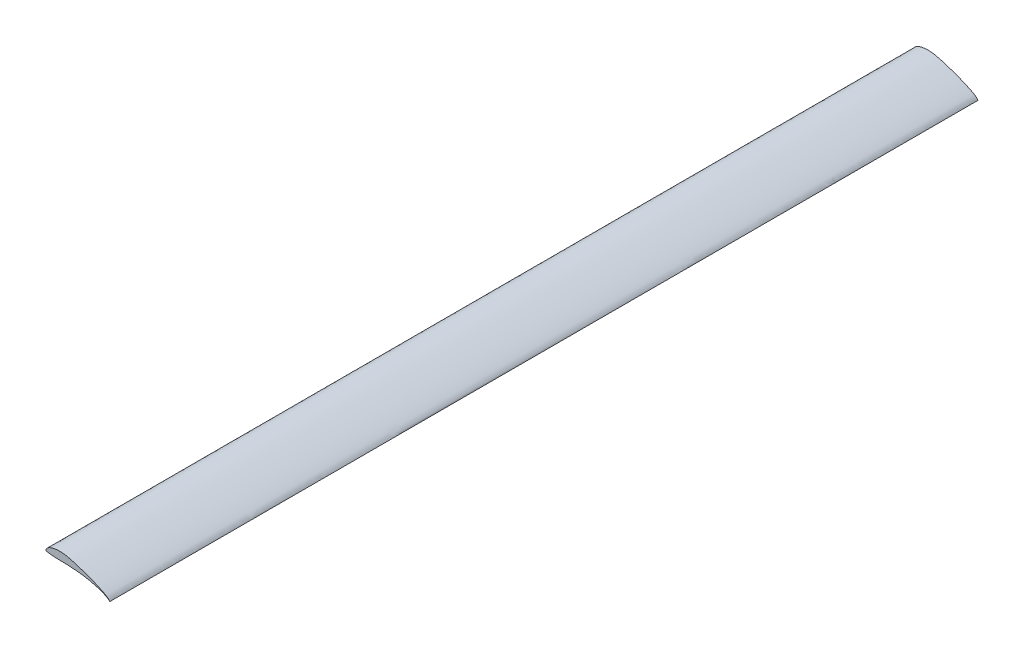
ISO-10303-21;
HEADER;
FILE_DESCRIPTION(('STEP AP214'),'2;1');
FILE_NAME('part.step','',(''),(''),'','','');
FILE_SCHEMA(('AUTOMOTIVE_DESIGN { 1 0 10303 214 1 1 1 1 }'));
ENDSEC;
DATA;
#1=APPLICATION_CONTEXT('core data for automotive mechanical design processes');
#2=APPLICATION_PROTOCOL_DEFINITION('international standard','automotive_design',2000,#1);
#3=PRODUCT_CONTEXT('',#1,'mechanical');
#4=PRODUCT('Part','Part','',(#3));
#5=PRODUCT_RELATED_PRODUCT_CATEGORY('part','',(#4));
#6=PRODUCT_DEFINITION_FORMATION('','',#4);
#7=PRODUCT_DEFINITION_CONTEXT('part definition',#1,'design');
#8=PRODUCT_DEFINITION('design','',#6,#7);
#9=PRODUCT_DEFINITION_SHAPE('','',#8);
#10=(LENGTH_UNIT() NAMED_UNIT(*) SI_UNIT(.MILLI.,.METRE.));
#11=(NAMED_UNIT(*) PLANE_ANGLE_UNIT() SI_UNIT($,.RADIAN.));
#12=(NAMED_UNIT(*) SI_UNIT($,.STERADIAN.) SOLID_ANGLE_UNIT());
#13=UNCERTAINTY_MEASURE_WITH_UNIT(LENGTH_MEASURE(1.E-05),#10,'distance_accuracy_value','');
#14=(GEOMETRIC_REPRESENTATION_CONTEXT(3) GLOBAL_UNCERTAINTY_ASSIGNED_CONTEXT((#13)) GLOBAL_UNIT_ASSIGNED_CONTEXT((#10,
#11,#12)) REPRESENTATION_CONTEXT('',''));
#15=CARTESIAN_POINT('',(0.,0.,0.));
#16=DIRECTION('',(0.,0.,1.));
#17=DIRECTION('',(1.,0.,0.));
#18=AXIS2_PLACEMENT_3D('',#15,#16,#17);
#19=CARTESIAN_POINT('',(15.6073556010727,-1.56828417678571,200.));
#20=CARTESIAN_POINT('',(15.6075205785342,-1.56792828931376,200.));
#21=CARTESIAN_POINT('',(15.5666355256365,-1.52199792415661,200.));
#22=CARTESIAN_POINT('',(15.5340442493287,-1.47350987831672,200.));
#23=CARTESIAN_POINT('',(15.4605913820454,-1.37112511847967,200.));
#24=CARTESIAN_POINT('',(15.3719351299635,-1.26004143937672,200.));
#25=CARTESIAN_POINT('',(15.2440623944885,-1.14012816080758,200.));
#26=CARTESIAN_POINT('',(15.0799786043002,-1.01564751221996,200.));
#27=CARTESIAN_POINT('',(14.8789593457907,-0.87960408046329,200.));
#28=CARTESIAN_POINT('',(14.6410791707967,-0.733331040152068,200.));
#29=CARTESIAN_POINT('',(14.3674017534494,-0.57773467678438,200.));
#30=CARTESIAN_POINT('',(14.0592794055988,-0.413955072610711,200.));
#31=CARTESIAN_POINT('',(13.7184554879633,-0.242822135430858,200.));
#32=CARTESIAN_POINT('',(13.3467388855174,-0.0656352281298716,200.));
#33=CARTESIAN_POINT('',(12.9462308106254,0.116444435869496,200.));
#34=CARTESIAN_POINT('',(12.5193127675065,0.302304316024054,200.));
#35=CARTESIAN_POINT('',(12.068610401303,0.490900193856606,200.));
#36=CARTESIAN_POINT('',(11.5966356091353,0.680536194865675,200.));
#37=CARTESIAN_POINT('',(11.1064494127692,0.870449839324894,200.));
#38=CARTESIAN_POINT('',(10.6007517630583,1.0589395474327,200.));
#39=CARTESIAN_POINT('',(10.0829533199798,1.24546758235926,200.));
#40=CARTESIAN_POINT('',(9.55634863075828,1.42872236472912,200.));
#41=CARTESIAN_POINT('',(9.02481164516599,1.60766669481645,200.));
#42=CARTESIAN_POINT('',(8.49279851458626,1.78187473591897,200.));
#43=CARTESIAN_POINT('',(7.96449699719473,1.94885299560569,200.));
#44=CARTESIAN_POINT('',(7.44408960646716,2.1066512876835,200.));
#45=CARTESIAN_POINT('',(6.93474388994981,2.25176808898628,200.));
#46=CARTESIAN_POINT('',(6.43899014701857,2.38153288237842,200.));
#47=CARTESIAN_POINT('',(5.95899159741484,2.49233557889264,200.));
#48=CARTESIAN_POINT('',(5.49771305375018,2.58606471092126,200.));
#49=CARTESIAN_POINT('',(5.05422828894595,2.65387012000129,200.));
#50=CARTESIAN_POINT('',(4.62799308438776,2.6939697545838,200.));
#51=CARTESIAN_POINT('',(4.21818223894239,2.71094492732191,200.));
#52=CARTESIAN_POINT('',(3.82466412735809,2.7046408767761,200.));
#53=CARTESIAN_POINT('',(3.44878228569033,2.67962464839311,200.));
#54=CARTESIAN_POINT('',(3.09239992045947,2.63732669550269,200.));
#55=CARTESIAN_POINT('',(2.75747001532161,2.5800503367162,200.));
#56=CARTESIAN_POINT('',(2.44605249943926,2.50804775819912,200.));
#57=CARTESIAN_POINT('',(2.15960590579229,2.4237825934562,200.));
#58=CARTESIAN_POINT('',(1.89985648502187,2.32852845240347,200.));
#59=CARTESIAN_POINT('',(1.66864709481554,2.22392148532528,200.));
#60=CARTESIAN_POINT('',(1.46669820268504,2.1130398993505,200.));
#61=CARTESIAN_POINT('',(1.29617273901626,1.9937738777975,200.));
#62=CARTESIAN_POINT('',(1.15800106874369,1.86726879636785,200.));
#63=CARTESIAN_POINT('',(1.04876713492988,1.73900856232654,200.));
#64=CARTESIAN_POINT('',(0.96956926797751,1.61218274584996,200.));
#65=CARTESIAN_POINT('',(0.919204632511056,1.49044026617973,200.));
#66=CARTESIAN_POINT('',(0.901811772446261,1.38228426153019,200.));
#67=CARTESIAN_POINT('',(0.909161213608458,1.27828881173907,200.));
#68=CARTESIAN_POINT('',(1.00169219943176,1.20835923688467,200.));
#69=CARTESIAN_POINT('',(1.13820486398537,1.17310703795196,200.));
#70=CARTESIAN_POINT('',(1.32551602484636,1.12761263984111,200.));
#71=CARTESIAN_POINT('',(1.56489899684205,1.08897730354085,200.));
#72=CARTESIAN_POINT('',(1.85196338521192,1.04945663878743,200.));
#73=CARTESIAN_POINT('',(2.18412272292521,1.01244389056638,200.));
#74=CARTESIAN_POINT('',(2.55790105954082,0.977943732547279,200.));
#75=CARTESIAN_POINT('',(2.97169677299687,0.947197561333583,200.));
#76=CARTESIAN_POINT('',(3.42722272463934,0.929519106729291,200.));
#77=CARTESIAN_POINT('',(3.92616435772225,0.922236855526299,200.));
#78=CARTESIAN_POINT('',(4.46876714958712,0.91439483636803,200.));
#79=CARTESIAN_POINT('',(5.05195995855821,0.903997189900747,200.));
#80=CARTESIAN_POINT('',(5.67131617438253,0.887401807594055,200.));
#81=CARTESIAN_POINT('',(6.32162548822597,0.861517497774373,200.));
#82=CARTESIAN_POINT('',(6.99729553353998,0.823888024229818,200.));
#83=CARTESIAN_POINT('',(7.69194046333776,0.772104240519352,200.));
#84=CARTESIAN_POINT('',(8.39895059700276,0.704869592204391,200.));
#85=CARTESIAN_POINT('',(9.11109842587144,0.620154088647604,200.));
#86=CARTESIAN_POINT('',(9.82104153202733,0.517856969956252,200.));
#87=CARTESIAN_POINT('',(10.5211102169245,0.397820397703997,200.));
#88=CARTESIAN_POINT('',(11.2035007811744,0.260330866534332,200.));
#89=CARTESIAN_POINT('',(11.8605658748815,0.106756158608835,200.));
#90=CARTESIAN_POINT('',(12.4848248394084,-0.0609358056359837,200.));
#91=CARTESIAN_POINT('',(13.0687778347613,-0.240695606115455,200.));
#92=CARTESIAN_POINT('',(13.605783796466,-0.428871834214653,200.));
#93=CARTESIAN_POINT('',(14.0890962646172,-0.621823990227955,200.));
#94=CARTESIAN_POINT('',(14.5134503356547,-0.815339228774323,200.));
#95=CARTESIAN_POINT('',(14.8716806678561,-1.00266928445844,200.));
#96=CARTESIAN_POINT('',(15.1592715156399,-1.18309157898065,200.));
#97=CARTESIAN_POINT('',(15.3596317564934,-1.33526278346817,200.));
#98=CARTESIAN_POINT('',(15.5032465834452,-1.46738856620124,200.));
#99=CARTESIAN_POINT('',(15.558359957824,-1.51842366915711,200.));
#100=CARTESIAN_POINT('',(15.6071872696343,-1.56864729941778,200.));
#101=CARTESIAN_POINT('',(15.6073556010727,-1.56828417678571,200.));
#102=B_SPLINE_CURVE_WITH_KNOTS('',3,(#19,#20,#21,#22,#23,#24,#25,#26,#27,#28,#29,#30,#31,#32,
#33,#34,#35,#36,#37,#38,#39,#40,#41,#42,#43,#44,#45,#46,#47,#48,#49,#50,#51,#52,#53,#54,#55,#56,
#57,#58,#59,#60,#61,#62,#63,#64,#65,#66,#67,#68,#69,#70,#71,#72,#73,#74,#75,#76,#77,#78,#79,#80,
#81,#82,#83,#84,#85,#86,#87,#88,#89,#90,#91,#92,#93,#94,#95,#96,#97,#98,#99,#100,#101),
.UNSPECIFIED.,.T.,.F.,(4,1,1,1,1,1,1,1,1,1,1,1,1,1,1,1,1,1,1,1,1,1,1,1,1,1,1,1,1,1,1,1,1,1,1,1,
1,1,1,1,1,1,1,1,1,1,1,1,1,1,1,1,1,1,1,1,1,1,1,1,1,1,1,1,1,1,1,1,1,1,1,1,1,1,1,1,1,1,1,1,4),(0.,
0.000979677557134127,0.0036488621677631,0.00748349851947815,0.0120952771855933,
0.0175255907768788,0.0240517799938711,0.0317830505527586,0.0406778280832618,0.0507103007904779,
0.0618332290621795,0.0739892504845854,0.0871181731906812,0.101145048769791,0.115990637111827,
0.131570421640589,0.147788379302961,0.164550916882416,0.181757895150531,0.199311954944345,
0.217095071712264,0.234990228463986,0.252856883122009,0.270540593729572,0.287886779266045,
0.304773437599674,0.321101419214061,0.336806063174811,0.351800032584037,0.366031063392082,
0.379615674919835,0.392652962879186,0.405170358707495,0.417171919049936,0.428603516911185,
0.439418959108259,0.449596586064162,0.459102079103161,0.467907877534646,0.475988300736527,
0.483308968746149,0.489874507816402,0.495803249719207,0.501149411695552,0.50590307325604,
0.510046768536663,0.513579310681042,0.516446926626751,0.5193500525909,0.523823355179486,
0.529973793997694,0.537715654387927,0.546967844488146,0.55763736682571,0.569620481096633,
0.582804124215616,0.597246960791632,0.613135036654701,0.630443600329816,0.649056123608545,
0.668822256795696,0.689594964002684,0.711189650864602,0.733426688964389,0.756094117504156,
0.778988553684861,0.801889682684955,0.824566597829707,0.846792284880412,0.868338290507787,
0.888978162959066,0.908492011340558,0.926658767581933,0.943286193042322,0.958169210358795,
0.971135821634751,0.981955623079976,0.990251791025976,0.995852565249962,0.999000405686701,1.),.UNSPECIFIED.);
#103=DIRECTION('',(0.,0.,-1.));
#104=VECTOR('',#103,1.);
#105=SURFACE_OF_LINEAR_EXTRUSION('',#102,#104);
#106=CARTESIAN_POINT('',(15.6073556010727,-1.56828417678571,200.));
#107=VERTEX_POINT('',#106);
#108=EDGE_CURVE('E10',#107,#107,#102,.T.);
#109=ORIENTED_EDGE('',*,*,#108,.F.);
#110=EDGE_LOOP('',(#109));
#111=FACE_BOUND('',#110,.T.);
#112=CARTESIAN_POINT('',(15.6073556010727,-1.56828417678571,0.));
#113=CARTESIAN_POINT('',(15.6075205785342,-1.56792828931376,0.));
#114=CARTESIAN_POINT('',(15.5666355256365,-1.52199792415661,0.));
#115=CARTESIAN_POINT('',(15.5340442493287,-1.47350987831672,0.));
#116=CARTESIAN_POINT('',(15.4605913820454,-1.37112511847967,0.));
#117=CARTESIAN_POINT('',(15.3719351299635,-1.26004143937672,0.));
#118=CARTESIAN_POINT('',(15.2440623944885,-1.14012816080758,0.));
#119=CARTESIAN_POINT('',(15.0799786043002,-1.01564751221996,0.));
#120=CARTESIAN_POINT('',(14.8789593457907,-0.87960408046329,0.));
#121=CARTESIAN_POINT('',(14.6410791707967,-0.733331040152068,0.));
#122=CARTESIAN_POINT('',(14.3674017534494,-0.57773467678438,0.));
#123=CARTESIAN_POINT('',(14.0592794055988,-0.413955072610711,0.));
#124=CARTESIAN_POINT('',(13.7184554879633,-0.242822135430858,0.));
#125=CARTESIAN_POINT('',(13.3467388855174,-0.0656352281298716,0.));
#126=CARTESIAN_POINT('',(12.9462308106254,0.116444435869496,0.));
#127=CARTESIAN_POINT('',(12.5193127675065,0.302304316024054,0.));
#128=CARTESIAN_POINT('',(12.068610401303,0.490900193856606,0.));
#129=CARTESIAN_POINT('',(11.5966356091353,0.680536194865675,0.));
#130=CARTESIAN_POINT('',(11.1064494127692,0.870449839324894,0.));
#131=CARTESIAN_POINT('',(10.6007517630583,1.0589395474327,0.));
#132=CARTESIAN_POINT('',(10.0829533199798,1.24546758235926,0.));
#133=CARTESIAN_POINT('',(9.55634863075828,1.42872236472912,0.));
#134=CARTESIAN_POINT('',(9.02481164516599,1.60766669481645,0.));
#135=CARTESIAN_POINT('',(8.49279851458626,1.78187473591897,0.));
#136=CARTESIAN_POINT('',(7.96449699719473,1.94885299560569,0.));
#137=CARTESIAN_POINT('',(7.44408960646716,2.1066512876835,0.));
#138=CARTESIAN_POINT('',(6.93474388994981,2.25176808898628,0.));
#139=CARTESIAN_POINT('',(6.43899014701857,2.38153288237842,0.));
#140=CARTESIAN_POINT('',(5.95899159741484,2.49233557889264,0.));
#141=CARTESIAN_POINT('',(5.49771305375018,2.58606471092126,0.));
#142=CARTESIAN_POINT('',(5.05422828894595,2.65387012000129,0.));
#143=CARTESIAN_POINT('',(4.62799308438776,2.6939697545838,0.));
#144=CARTESIAN_POINT('',(4.21818223894239,2.71094492732191,0.));
#145=CARTESIAN_POINT('',(3.82466412735809,2.7046408767761,0.));
#146=CARTESIAN_POINT('',(3.44878228569033,2.67962464839311,0.));
#147=CARTESIAN_POINT('',(3.09239992045947,2.63732669550269,0.));
#148=CARTESIAN_POINT('',(2.75747001532161,2.5800503367162,0.));
#149=CARTESIAN_POINT('',(2.44605249943926,2.50804775819912,0.));
#150=CARTESIAN_POINT('',(2.15960590579229,2.4237825934562,0.));
#151=CARTESIAN_POINT('',(1.89985648502187,2.32852845240347,0.));
#152=CARTESIAN_POINT('',(1.66864709481554,2.22392148532528,0.));
#153=CARTESIAN_POINT('',(1.46669820268504,2.1130398993505,0.));
#154=CARTESIAN_POINT('',(1.29617273901626,1.9937738777975,0.));
#155=CARTESIAN_POINT('',(1.15800106874369,1.86726879636785,0.));
#156=CARTESIAN_POINT('',(1.04876713492988,1.73900856232654,0.));
#157=CARTESIAN_POINT('',(0.96956926797751,1.61218274584996,0.));
#158=CARTESIAN_POINT('',(0.919204632511056,1.49044026617973,0.));
#159=CARTESIAN_POINT('',(0.901811772446261,1.38228426153019,0.));
#160=CARTESIAN_POINT('',(0.909161213608458,1.27828881173907,0.));
#161=CARTESIAN_POINT('',(1.00169219943176,1.20835923688467,0.));
#162=CARTESIAN_POINT('',(1.13820486398537,1.17310703795196,0.));
#163=CARTESIAN_POINT('',(1.32551602484636,1.12761263984111,0.));
#164=CARTESIAN_POINT('',(1.56489899684205,1.08897730354085,0.));
#165=CARTESIAN_POINT('',(1.85196338521192,1.04945663878743,0.));
#166=CARTESIAN_POINT('',(2.18412272292521,1.01244389056638,0.));
#167=CARTESIAN_POINT('',(2.55790105954082,0.977943732547279,0.));
#168=CARTESIAN_POINT('',(2.97169677299687,0.947197561333583,0.));
#169=CARTESIAN_POINT('',(3.42722272463934,0.929519106729291,0.));
#170=CARTESIAN_POINT('',(3.92616435772225,0.922236855526299,0.));
#171=CARTESIAN_POINT('',(4.46876714958712,0.91439483636803,0.));
#172=CARTESIAN_POINT('',(5.05195995855821,0.903997189900747,0.));
#173=CARTESIAN_POINT('',(5.67131617438253,0.887401807594055,0.));
#174=CARTESIAN_POINT('',(6.32162548822597,0.861517497774373,0.));
#175=CARTESIAN_POINT('',(6.99729553353998,0.823888024229818,0.));
#176=CARTESIAN_POINT('',(7.69194046333776,0.772104240519352,0.));
#177=CARTESIAN_POINT('',(8.39895059700276,0.704869592204391,0.));
#178=CARTESIAN_POINT('',(9.11109842587144,0.620154088647604,0.));
#179=CARTESIAN_POINT('',(9.82104153202733,0.517856969956252,0.));
#180=CARTESIAN_POINT('',(10.5211102169245,0.397820397703997,0.));
#181=CARTESIAN_POINT('',(11.2035007811744,0.260330866534332,0.));
#182=CARTESIAN_POINT('',(11.8605658748815,0.106756158608835,0.));
#183=CARTESIAN_POINT('',(12.4848248394084,-0.0609358056359837,0.));
#184=CARTESIAN_POINT('',(13.0687778347613,-0.240695606115455,0.));
#185=CARTESIAN_POINT('',(13.605783796466,-0.428871834214653,0.));
#186=CARTESIAN_POINT('',(14.0890962646172,-0.621823990227955,0.));
#187=CARTESIAN_POINT('',(14.5134503356547,-0.815339228774323,0.));
#188=CARTESIAN_POINT('',(14.8716806678561,-1.00266928445844,0.));
#189=CARTESIAN_POINT('',(15.1592715156399,-1.18309157898065,0.));
#190=CARTESIAN_POINT('',(15.3596317564934,-1.33526278346817,0.));
#191=CARTESIAN_POINT('',(15.5032465834452,-1.46738856620124,0.));
#192=CARTESIAN_POINT('',(15.558359957824,-1.51842366915711,0.));
#193=CARTESIAN_POINT('',(15.6071872696343,-1.56864729941778,0.));
#194=CARTESIAN_POINT('',(15.6073556010727,-1.56828417678571,0.));
#195=B_SPLINE_CURVE_WITH_KNOTS('',3,(#112,#113,#114,#115,#116,#117,#118,#119,#120,#121,#122,
#123,#124,#125,#126,#127,#128,#129,#130,#131,#132,#133,#134,#135,#136,#137,#138,#139,#140,#141,
#142,#143,#144,#145,#146,#147,#148,#149,#150,#151,#152,#153,#154,#155,#156,#157,#158,#159,#160,
#161,#162,#163,#164,#165,#166,#167,#168,#169,#170,#171,#172,#173,#174,#175,#176,#177,#178,#179,
#180,#181,#182,#183,#184,#185,#186,#187,#188,#189,#190,#191,#192,#193,#194),.UNSPECIFIED.,.T.,
.F.,(4,1,1,1,1,1,1,1,1,1,1,1,1,1,1,1,1,1,1,1,1,1,1,1,1,1,1,1,1,1,1,1,1,1,1,1,1,1,1,1,1,1,1,1,1,
1,1,1,1,1,1,1,1,1,1,1,1,1,1,1,1,1,1,1,1,1,1,1,1,1,1,1,1,1,1,1,1,1,1,1,4),(0.,
0.000979677557134127,0.0036488621677631,0.00748349851947815,0.0120952771855933,
0.0175255907768788,0.0240517799938711,0.0317830505527586,0.0406778280832618,0.0507103007904779,
0.0618332290621795,0.0739892504845854,0.0871181731906812,0.101145048769791,0.115990637111827,
0.131570421640589,0.147788379302961,0.164550916882416,0.181757895150531,0.199311954944345,
0.217095071712264,0.234990228463986,0.252856883122009,0.270540593729572,0.287886779266045,
0.304773437599674,0.321101419214061,0.336806063174811,0.351800032584037,0.366031063392082,
0.379615674919835,0.392652962879186,0.405170358707495,0.417171919049936,0.428603516911185,
0.439418959108259,0.449596586064162,0.459102079103161,0.467907877534646,0.475988300736527,
0.483308968746149,0.489874507816402,0.495803249719207,0.501149411695552,0.50590307325604,
0.510046768536663,0.513579310681042,0.516446926626751,0.5193500525909,0.523823355179486,
0.529973793997694,0.537715654387927,0.546967844488146,0.55763736682571,0.569620481096633,
0.582804124215616,0.597246960791632,0.613135036654701,0.630443600329816,0.649056123608545,
0.668822256795696,0.689594964002684,0.711189650864602,0.733426688964389,0.756094117504156,
0.778988553684861,0.801889682684955,0.824566597829707,0.846792284880412,0.868338290507787,
0.888978162959066,0.908492011340558,0.926658767581933,0.943286193042322,0.958169210358795,
0.971135821634751,0.981955623079976,0.990251791025976,0.995852565249962,0.999000405686701,1.),.UNSPECIFIED.);
#196=CARTESIAN_POINT('',(15.6073556010727,-1.56828417678571,0.));
#197=VERTEX_POINT('',#196);
#198=EDGE_CURVE('E45',#197,#197,#195,.T.);
#199=ORIENTED_EDGE('',*,*,#198,.T.);
#200=EDGE_LOOP('',(#199));
#201=FACE_BOUND('',#200,.T.);
#202=ADVANCED_FACE('F41',(#111,#201),#105,.F.);
#203=CARTESIAN_POINT('',(1.06996983934282,1.7606021800324,200.));
#204=DIRECTION('',(0.,0.,-1.));
#205=DIRECTION('',(-1.,0.,0.));
#206=AXIS2_PLACEMENT_3D('',#203,#204,#205);
#207=PLANE('',#206);
#208=ORIENTED_EDGE('',*,*,#108,.T.);
#209=EDGE_LOOP('',(#208));
#210=FACE_BOUND('',#209,.T.);
#211=ADVANCED_FACE('F64',(#210),#207,.F.);
#212=CARTESIAN_POINT('',(1.06996983934282,1.7606021800324,0.));
#213=DIRECTION('',(0.,0.,-1.));
#214=DIRECTION('',(-1.,0.,0.));
#215=AXIS2_PLACEMENT_3D('',#212,#213,#214);
#216=PLANE('',#215);
#217=ORIENTED_EDGE('',*,*,#198,.F.);
#218=EDGE_LOOP('',(#217));
#219=FACE_BOUND('',#218,.T.);
#220=ADVANCED_FACE('F62',(#219),#216,.T.);
#221=CLOSED_SHELL('',(#202,#211,#220));
#222=MANIFOLD_SOLID_BREP('B2',#221);
#223=ADVANCED_BREP_SHAPE_REPRESENTATION('',(#18,#222),#14);
#224=SHAPE_DEFINITION_REPRESENTATION(#9,#223);
ENDSEC;
END-ISO-10303-21;
